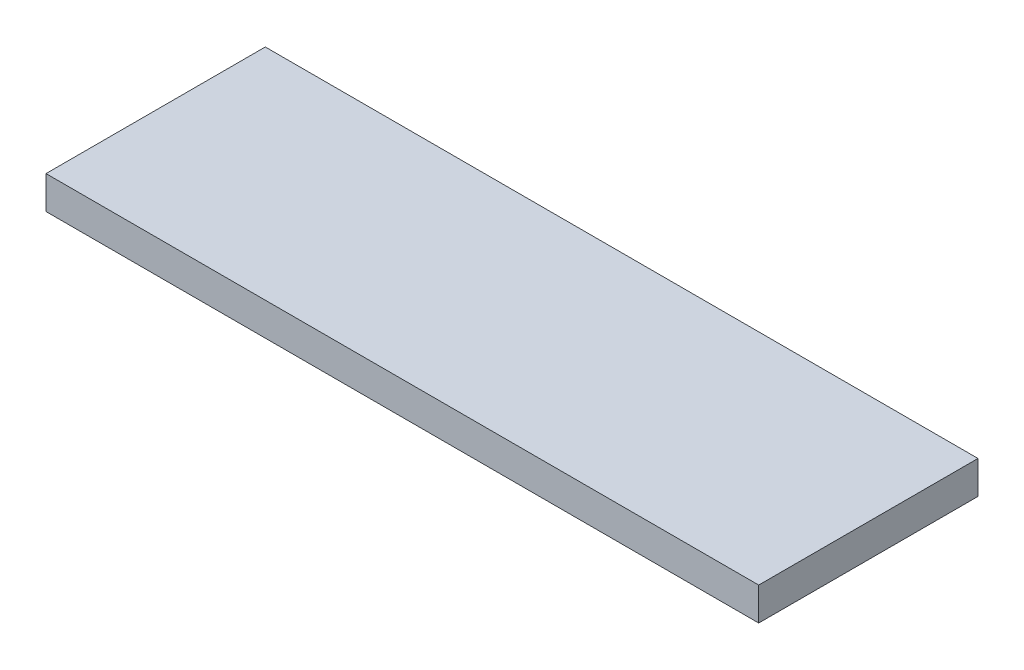
ISO-10303-21;
HEADER;
FILE_DESCRIPTION(('STEP AP214'),'2;1');
FILE_NAME('part.step','',(''),(''),'','','');
FILE_SCHEMA(('AUTOMOTIVE_DESIGN { 1 0 10303 214 1 1 1 1 }'));
ENDSEC;
DATA;
#1=APPLICATION_CONTEXT('core data for automotive mechanical design processes');
#2=APPLICATION_PROTOCOL_DEFINITION('international standard','automotive_design',2000,#1);
#3=PRODUCT_CONTEXT('',#1,'mechanical');
#4=PRODUCT('Part','Part','',(#3));
#5=PRODUCT_RELATED_PRODUCT_CATEGORY('part','',(#4));
#6=PRODUCT_DEFINITION_FORMATION('','',#4);
#7=PRODUCT_DEFINITION_CONTEXT('part definition',#1,'design');
#8=PRODUCT_DEFINITION('design','',#6,#7);
#9=PRODUCT_DEFINITION_SHAPE('','',#8);
#10=(LENGTH_UNIT() NAMED_UNIT(*) SI_UNIT(.MILLI.,.METRE.));
#11=(NAMED_UNIT(*) PLANE_ANGLE_UNIT() SI_UNIT($,.RADIAN.));
#12=(NAMED_UNIT(*) SI_UNIT($,.STERADIAN.) SOLID_ANGLE_UNIT());
#13=UNCERTAINTY_MEASURE_WITH_UNIT(LENGTH_MEASURE(1.E-05),#10,'distance_accuracy_value','');
#14=(GEOMETRIC_REPRESENTATION_CONTEXT(3) GLOBAL_UNCERTAINTY_ASSIGNED_CONTEXT((#13)) GLOBAL_UNIT_ASSIGNED_CONTEXT((#10,
#11,#12)) REPRESENTATION_CONTEXT('',''));
#15=CARTESIAN_POINT('',(0.,0.,0.));
#16=DIRECTION('',(0.,0.,1.));
#17=DIRECTION('',(1.,0.,0.));
#18=AXIS2_PLACEMENT_3D('',#15,#16,#17);
#19=CARTESIAN_POINT('',(90.,-10.,0.));
#20=DIRECTION('',(0.,1.,0.));
#21=DIRECTION('',(0.,0.,1.));
#22=AXIS2_PLACEMENT_3D('',#19,#20,#21);
#23=PLANE('',#22);
#24=DIRECTION('',(0.,0.,1.));
#25=VECTOR('',#24,1.);
#26=CARTESIAN_POINT('',(50.65,-10.,0.));
#27=LINE('',#26,#25);
#28=CARTESIAN_POINT('',(50.65,-10.,-5.65));
#29=VERTEX_POINT('',#28);
#30=CARTESIAN_POINT('',(50.65,-10.,5.65));
#31=VERTEX_POINT('',#30);
#32=EDGE_CURVE('E412',#29,#31,#27,.T.);
#33=ORIENTED_EDGE('',*,*,#32,.T.);
#34=DIRECTION('',(-1.,0.,0.));
#35=VECTOR('',#34,1.);
#36=CARTESIAN_POINT('',(90.,-10.,5.65));
#37=LINE('',#36,#35);
#38=CARTESIAN_POINT('',(39.35,-10.,5.65));
#39=VERTEX_POINT('',#38);
#40=EDGE_CURVE('E416',#31,#39,#37,.T.);
#41=ORIENTED_EDGE('',*,*,#40,.T.);
#42=DIRECTION('',(0.,0.,-1.));
#43=VECTOR('',#42,1.);
#44=CARTESIAN_POINT('',(39.35,-10.,0.));
#45=LINE('',#44,#43);
#46=CARTESIAN_POINT('',(39.35,-10.,-5.65));
#47=VERTEX_POINT('',#46);
#48=EDGE_CURVE('E406',#39,#47,#45,.T.);
#49=ORIENTED_EDGE('',*,*,#48,.T.);
#50=DIRECTION('',(1.,0.,0.));
#51=VECTOR('',#50,1.);
#52=CARTESIAN_POINT('',(90.,-10.,-5.65));
#53=LINE('',#52,#51);
#54=EDGE_CURVE('E411',#47,#29,#53,.T.);
#55=ORIENTED_EDGE('',*,*,#54,.T.);
#56=EDGE_LOOP('',(#33,#41,#49,#55));
#57=FACE_BOUND('',#56,.T.);
#58=ADVANCED_FACE('F50',(#57),#23,.F.);
#59=CARTESIAN_POINT('',(38.85,-10.,6.15));
#60=DIRECTION('',(0.,0.,-1.));
#61=DIRECTION('',(-1.,0.,0.));
#62=AXIS2_PLACEMENT_3D('',#59,#60,#61);
#63=PLANE('',#62);
#64=DIRECTION('',(0.,1.,0.));
#65=VECTOR('',#64,1.);
#66=CARTESIAN_POINT('',(38.85,-10.,6.15));
#67=LINE('',#66,#65);
#68=CARTESIAN_POINT('',(38.85,-9.5,6.15));
#69=VERTEX_POINT('',#68);
#70=CARTESIAN_POINT('',(38.85,0.,6.15));
#71=VERTEX_POINT('',#70);
#72=EDGE_CURVE('E396',#69,#71,#67,.T.);
#73=ORIENTED_EDGE('',*,*,#72,.F.);
#74=DIRECTION('',(1.,0.,0.));
#75=VECTOR('',#74,1.);
#76=CARTESIAN_POINT('',(38.85,-9.5,6.15));
#77=LINE('',#76,#75);
#78=CARTESIAN_POINT('',(51.15,-9.5,6.15));
#79=VERTEX_POINT('',#78);
#80=EDGE_CURVE('E425',#69,#79,#77,.T.);
#81=ORIENTED_EDGE('',*,*,#80,.T.);
#82=DIRECTION('',(0.,1.,0.));
#83=VECTOR('',#82,1.);
#84=CARTESIAN_POINT('',(51.15,-10.,6.15));
#85=LINE('',#84,#83);
#86=CARTESIAN_POINT('',(51.15,0.,6.15));
#87=VERTEX_POINT('',#86);
#88=EDGE_CURVE('E407',#79,#87,#85,.T.);
#89=ORIENTED_EDGE('',*,*,#88,.T.);
#90=DIRECTION('',(-1.,0.,0.));
#91=VECTOR('',#90,1.);
#92=CARTESIAN_POINT('',(38.85,0.,6.15));
#93=LINE('',#92,#91);
#94=EDGE_CURVE('E384',#87,#71,#93,.T.);
#95=ORIENTED_EDGE('',*,*,#94,.T.);
#96=EDGE_LOOP('',(#73,#81,#89,#95));
#97=FACE_BOUND('',#96,.T.);
#98=ADVANCED_FACE('F591',(#97),#63,.F.);
#99=CARTESIAN_POINT('',(51.15,-10.,-6.15));
#100=DIRECTION('',(-1.,0.,0.));
#101=DIRECTION('',(0.,0.,1.));
#102=AXIS2_PLACEMENT_3D('',#99,#100,#101);
#103=PLANE('',#102);
#104=ORIENTED_EDGE('',*,*,#88,.F.);
#105=DIRECTION('',(0.,0.,-1.));
#106=VECTOR('',#105,1.);
#107=CARTESIAN_POINT('',(51.15,-9.5,-6.15));
#108=LINE('',#107,#106);
#109=CARTESIAN_POINT('',(51.15,-9.5,-6.15));
#110=VERTEX_POINT('',#109);
#111=EDGE_CURVE('E426',#79,#110,#108,.T.);
#112=ORIENTED_EDGE('',*,*,#111,.T.);
#113=DIRECTION('',(0.,1.,0.));
#114=VECTOR('',#113,1.);
#115=CARTESIAN_POINT('',(51.15,-10.,-6.15));
#116=LINE('',#115,#114);
#117=CARTESIAN_POINT('',(51.15,0.,-6.15));
#118=VERTEX_POINT('',#117);
#119=EDGE_CURVE('E401',#110,#118,#116,.T.);
#120=ORIENTED_EDGE('',*,*,#119,.T.);
#121=DIRECTION('',(0.,0.,1.));
#122=VECTOR('',#121,1.);
#123=CARTESIAN_POINT('',(51.15,0.,-6.15));
#124=LINE('',#123,#122);
#125=EDGE_CURVE('E386',#118,#87,#124,.T.);
#126=ORIENTED_EDGE('',*,*,#125,.T.);
#127=EDGE_LOOP('',(#104,#112,#120,#126));
#128=FACE_BOUND('',#127,.T.);
#129=ADVANCED_FACE('F598',(#128),#103,.F.);
#130=CARTESIAN_POINT('',(38.85,-10.,-6.15));
#131=DIRECTION('',(0.,0.,1.));
#132=DIRECTION('',(1.,0.,0.));
#133=AXIS2_PLACEMENT_3D('',#130,#131,#132);
#134=PLANE('',#133);
#135=ORIENTED_EDGE('',*,*,#119,.F.);
#136=DIRECTION('',(-1.,0.,0.));
#137=VECTOR('',#136,1.);
#138=CARTESIAN_POINT('',(38.85,-9.5,-6.15));
#139=LINE('',#138,#137);
#140=CARTESIAN_POINT('',(38.85,-9.5,-6.15));
#141=VERTEX_POINT('',#140);
#142=EDGE_CURVE('E427',#110,#141,#139,.T.);
#143=ORIENTED_EDGE('',*,*,#142,.T.);
#144=DIRECTION('',(0.,1.,0.));
#145=VECTOR('',#144,1.);
#146=CARTESIAN_POINT('',(38.85,-10.,-6.15));
#147=LINE('',#146,#145);
#148=CARTESIAN_POINT('',(38.85,0.,-6.15));
#149=VERTEX_POINT('',#148);
#150=EDGE_CURVE('E399',#141,#149,#147,.T.);
#151=ORIENTED_EDGE('',*,*,#150,.T.);
#152=DIRECTION('',(1.,0.,0.));
#153=VECTOR('',#152,1.);
#154=CARTESIAN_POINT('',(38.85,0.,-6.15));
#155=LINE('',#154,#153);
#156=EDGE_CURVE('E394',#149,#118,#155,.T.);
#157=ORIENTED_EDGE('',*,*,#156,.T.);
#158=EDGE_LOOP('',(#135,#143,#151,#157));
#159=FACE_BOUND('',#158,.T.);
#160=ADVANCED_FACE('F866',(#159),#134,.F.);
#161=CARTESIAN_POINT('',(38.85,-10.,-6.15));
#162=DIRECTION('',(1.,0.,0.));
#163=DIRECTION('',(0.,0.,-1.));
#164=AXIS2_PLACEMENT_3D('',#161,#162,#163);
#165=PLANE('',#164);
#166=ORIENTED_EDGE('',*,*,#150,.F.);
#167=DIRECTION('',(0.,0.,1.));
#168=VECTOR('',#167,1.);
#169=CARTESIAN_POINT('',(38.85,-9.5,-6.15));
#170=LINE('',#169,#168);
#171=EDGE_CURVE('E435',#141,#69,#170,.T.);
#172=ORIENTED_EDGE('',*,*,#171,.T.);
#173=ORIENTED_EDGE('',*,*,#72,.T.);
#174=DIRECTION('',(0.,0.,-1.));
#175=VECTOR('',#174,1.);
#176=CARTESIAN_POINT('',(38.85,0.,-6.15));
#177=LINE('',#176,#175);
#178=EDGE_CURVE('E381',#71,#149,#177,.T.);
#179=ORIENTED_EDGE('',*,*,#178,.T.);
#180=EDGE_LOOP('',(#166,#172,#173,#179));
#181=FACE_BOUND('',#180,.T.);
#182=ADVANCED_FACE('F858',(#181),#165,.F.);
#183=CARTESIAN_POINT('',(60.,-10.,0.));
#184=DIRECTION('',(0.,1.,0.));
#185=DIRECTION('',(0.,0.,1.));
#186=AXIS2_PLACEMENT_3D('',#183,#184,#185);
#187=PLANE('',#186);
#188=DIRECTION('',(0.,0.,1.));
#189=VECTOR('',#188,1.);
#190=CARTESIAN_POINT('',(20.65,-10.,0.));
#191=LINE('',#190,#189);
#192=CARTESIAN_POINT('',(20.65,-10.,-5.65));
#193=VERTEX_POINT('',#192);
#194=CARTESIAN_POINT('',(20.65,-10.,5.65));
#195=VERTEX_POINT('',#194);
#196=EDGE_CURVE('E442',#193,#195,#191,.T.);
#197=ORIENTED_EDGE('',*,*,#196,.T.);
#198=DIRECTION('',(-1.,0.,0.));
#199=VECTOR('',#198,1.);
#200=CARTESIAN_POINT('',(60.,-10.,5.65));
#201=LINE('',#200,#199);
#202=CARTESIAN_POINT('',(9.35000000000001,-10.,5.65));
#203=VERTEX_POINT('',#202);
#204=EDGE_CURVE('E441',#195,#203,#201,.T.);
#205=ORIENTED_EDGE('',*,*,#204,.T.);
#206=DIRECTION('',(0.,0.,-1.));
#207=VECTOR('',#206,1.);
#208=CARTESIAN_POINT('',(9.35000000000001,-10.,0.));
#209=LINE('',#208,#207);
#210=CARTESIAN_POINT('',(9.35000000000001,-10.,-5.65));
#211=VERTEX_POINT('',#210);
#212=EDGE_CURVE('E434',#203,#211,#209,.T.);
#213=ORIENTED_EDGE('',*,*,#212,.T.);
#214=DIRECTION('',(1.,0.,0.));
#215=VECTOR('',#214,1.);
#216=CARTESIAN_POINT('',(60.,-10.,-5.65));
#217=LINE('',#216,#215);
#218=EDGE_CURVE('E437',#211,#193,#217,.T.);
#219=ORIENTED_EDGE('',*,*,#218,.T.);
#220=EDGE_LOOP('',(#197,#205,#213,#219));
#221=FACE_BOUND('',#220,.T.);
#222=ADVANCED_FACE('F847',(#221),#187,.F.);
#223=CARTESIAN_POINT('',(8.85000000000001,-10.,6.15));
#224=DIRECTION('',(0.,0.,-1.));
#225=DIRECTION('',(-1.,0.,0.));
#226=AXIS2_PLACEMENT_3D('',#223,#224,#225);
#227=PLANE('',#226);
#228=DIRECTION('',(0.,1.,0.));
#229=VECTOR('',#228,1.);
#230=CARTESIAN_POINT('',(8.85000000000001,-10.,6.15));
#231=LINE('',#230,#229);
#232=CARTESIAN_POINT('',(8.85000000000001,-9.5,6.15));
#233=VERTEX_POINT('',#232);
#234=CARTESIAN_POINT('',(8.85000000000001,0.,6.15));
#235=VERTEX_POINT('',#234);
#236=EDGE_CURVE('E375',#233,#235,#231,.T.);
#237=ORIENTED_EDGE('',*,*,#236,.F.);
#238=DIRECTION('',(1.,0.,0.));
#239=VECTOR('',#238,1.);
#240=CARTESIAN_POINT('',(8.85000000000001,-9.5,6.15));
#241=LINE('',#240,#239);
#242=CARTESIAN_POINT('',(21.15,-9.5,6.15));
#243=VERTEX_POINT('',#242);
#244=EDGE_CURVE('E449',#233,#243,#241,.T.);
#245=ORIENTED_EDGE('',*,*,#244,.T.);
#246=DIRECTION('',(0.,1.,0.));
#247=VECTOR('',#246,1.);
#248=CARTESIAN_POINT('',(21.15,-10.,6.15));
#249=LINE('',#248,#247);
#250=CARTESIAN_POINT('',(21.15,0.,6.15));
#251=VERTEX_POINT('',#250);
#252=EDGE_CURVE('E378',#243,#251,#249,.T.);
#253=ORIENTED_EDGE('',*,*,#252,.T.);
#254=DIRECTION('',(-1.,0.,0.));
#255=VECTOR('',#254,1.);
#256=CARTESIAN_POINT('',(8.85000000000001,0.,6.15));
#257=LINE('',#256,#255);
#258=EDGE_CURVE('E356',#251,#235,#257,.T.);
#259=ORIENTED_EDGE('',*,*,#258,.T.);
#260=EDGE_LOOP('',(#237,#245,#253,#259));
#261=FACE_BOUND('',#260,.T.);
#262=ADVANCED_FACE('F838',(#261),#227,.F.);
#263=CARTESIAN_POINT('',(21.15,-10.,-6.15));
#264=DIRECTION('',(-1.,0.,0.));
#265=DIRECTION('',(0.,0.,1.));
#266=AXIS2_PLACEMENT_3D('',#263,#264,#265);
#267=PLANE('',#266);
#268=ORIENTED_EDGE('',*,*,#252,.F.);
#269=DIRECTION('',(0.,0.,-1.));
#270=VECTOR('',#269,1.);
#271=CARTESIAN_POINT('',(21.15,-9.5,-6.15));
#272=LINE('',#271,#270);
#273=CARTESIAN_POINT('',(21.15,-9.5,-6.15));
#274=VERTEX_POINT('',#273);
#275=EDGE_CURVE('E454',#243,#274,#272,.T.);
#276=ORIENTED_EDGE('',*,*,#275,.T.);
#277=DIRECTION('',(0.,1.,0.));
#278=VECTOR('',#277,1.);
#279=CARTESIAN_POINT('',(21.15,-10.,-6.15));
#280=LINE('',#279,#278);
#281=CARTESIAN_POINT('',(21.15,0.,-6.15));
#282=VERTEX_POINT('',#281);
#283=EDGE_CURVE('E374',#274,#282,#280,.T.);
#284=ORIENTED_EDGE('',*,*,#283,.T.);
#285=DIRECTION('',(0.,0.,1.));
#286=VECTOR('',#285,1.);
#287=CARTESIAN_POINT('',(21.15,0.,-6.15));
#288=LINE('',#287,#286);
#289=EDGE_CURVE('E363',#282,#251,#288,.T.);
#290=ORIENTED_EDGE('',*,*,#289,.T.);
#291=EDGE_LOOP('',(#268,#276,#284,#290));
#292=FACE_BOUND('',#291,.T.);
#293=ADVANCED_FACE('F827',(#292),#267,.F.);
#294=CARTESIAN_POINT('',(8.85000000000001,-10.,-6.15));
#295=DIRECTION('',(0.,0.,1.));
#296=DIRECTION('',(1.,0.,0.));
#297=AXIS2_PLACEMENT_3D('',#294,#295,#296);
#298=PLANE('',#297);
#299=ORIENTED_EDGE('',*,*,#283,.F.);
#300=DIRECTION('',(-1.,0.,0.));
#301=VECTOR('',#300,1.);
#302=CARTESIAN_POINT('',(8.85000000000001,-9.5,-6.15));
#303=LINE('',#302,#301);
#304=CARTESIAN_POINT('',(8.85000000000001,-9.5,-6.15));
#305=VERTEX_POINT('',#304);
#306=EDGE_CURVE('E451',#274,#305,#303,.T.);
#307=ORIENTED_EDGE('',*,*,#306,.T.);
#308=DIRECTION('',(0.,1.,0.));
#309=VECTOR('',#308,1.);
#310=CARTESIAN_POINT('',(8.85000000000001,-10.,-6.15));
#311=LINE('',#310,#309);
#312=CARTESIAN_POINT('',(8.85000000000001,0.,-6.15));
#313=VERTEX_POINT('',#312);
#314=EDGE_CURVE('E369',#305,#313,#311,.T.);
#315=ORIENTED_EDGE('',*,*,#314,.T.);
#316=DIRECTION('',(1.,0.,0.));
#317=VECTOR('',#316,1.);
#318=CARTESIAN_POINT('',(8.85000000000001,0.,-6.15));
#319=LINE('',#318,#317);
#320=EDGE_CURVE('E364',#313,#282,#319,.T.);
#321=ORIENTED_EDGE('',*,*,#320,.T.);
#322=EDGE_LOOP('',(#299,#307,#315,#321));
#323=FACE_BOUND('',#322,.T.);
#324=ADVANCED_FACE('F814',(#323),#298,.F.);
#325=CARTESIAN_POINT('',(8.85000000000001,-10.,-6.15));
#326=DIRECTION('',(1.,0.,0.));
#327=DIRECTION('',(0.,0.,-1.));
#328=AXIS2_PLACEMENT_3D('',#325,#326,#327);
#329=PLANE('',#328);
#330=ORIENTED_EDGE('',*,*,#314,.F.);
#331=DIRECTION('',(0.,0.,1.));
#332=VECTOR('',#331,1.);
#333=CARTESIAN_POINT('',(8.85000000000001,-9.5,-6.15));
#334=LINE('',#333,#332);
#335=EDGE_CURVE('E456',#305,#233,#334,.T.);
#336=ORIENTED_EDGE('',*,*,#335,.T.);
#337=ORIENTED_EDGE('',*,*,#236,.T.);
#338=DIRECTION('',(0.,0.,-1.));
#339=VECTOR('',#338,1.);
#340=CARTESIAN_POINT('',(8.85000000000001,0.,-6.15));
#341=LINE('',#340,#339);
#342=EDGE_CURVE('E354',#235,#313,#341,.T.);
#343=ORIENTED_EDGE('',*,*,#342,.T.);
#344=EDGE_LOOP('',(#330,#336,#337,#343));
#345=FACE_BOUND('',#344,.T.);
#346=ADVANCED_FACE('F809',(#345),#329,.F.);
#347=CARTESIAN_POINT('',(0.,0.,0.));
#348=DIRECTION('',(0.,1.,0.));
#349=DIRECTION('',(0.,0.,1.));
#350=AXIS2_PLACEMENT_3D('',#347,#348,#349);
#351=PLANE('',#350);
#352=DIRECTION('',(0.,0.,-1.));
#353=VECTOR('',#352,1.);
#354=CARTESIAN_POINT('',(-51.15,0.,-6.15));
#355=LINE('',#354,#353);
#356=CARTESIAN_POINT('',(-51.15,0.,6.15));
#357=VERTEX_POINT('',#356);
#358=CARTESIAN_POINT('',(-51.15,0.,-6.15));
#359=VERTEX_POINT('',#358);
#360=EDGE_CURVE('E259',#357,#359,#355,.T.);
#361=ORIENTED_EDGE('',*,*,#360,.F.);
#362=DIRECTION('',(-1.,0.,0.));
#363=VECTOR('',#362,1.);
#364=CARTESIAN_POINT('',(-51.15,0.,6.15));
#365=LINE('',#364,#363);
#366=CARTESIAN_POINT('',(-38.85,0.,6.15));
#367=VERTEX_POINT('',#366);
#368=EDGE_CURVE('E293',#367,#357,#365,.T.);
#369=ORIENTED_EDGE('',*,*,#368,.F.);
#370=DIRECTION('',(0.,0.,1.));
#371=VECTOR('',#370,1.);
#372=CARTESIAN_POINT('',(-38.85,0.,-6.15));
#373=LINE('',#372,#371);
#374=CARTESIAN_POINT('',(-38.85,0.,-6.15));
#375=VERTEX_POINT('',#374);
#376=EDGE_CURVE('E292',#375,#367,#373,.T.);
#377=ORIENTED_EDGE('',*,*,#376,.F.);
#378=DIRECTION('',(1.,0.,0.));
#379=VECTOR('',#378,1.);
#380=CARTESIAN_POINT('',(-51.15,0.,-6.15));
#381=LINE('',#380,#379);
#382=EDGE_CURVE('E289',#359,#375,#381,.T.);
#383=ORIENTED_EDGE('',*,*,#382,.F.);
#384=EDGE_LOOP('',(#361,#369,#377,#383));
#385=FACE_BOUND('',#384,.T.);
#386=DIRECTION('',(0.,0.,-1.));
#387=VECTOR('',#386,1.);
#388=CARTESIAN_POINT('',(65.,0.,-20.));
#389=LINE('',#388,#387);
#390=CARTESIAN_POINT('',(65.,0.,20.));
#391=VERTEX_POINT('',#390);
#392=CARTESIAN_POINT('',(65.,0.,-20.));
#393=VERTEX_POINT('',#392);
#394=EDGE_CURVE('E313',#391,#393,#389,.T.);
#395=ORIENTED_EDGE('',*,*,#394,.F.);
#396=DIRECTION('',(1.,0.,0.));
#397=VECTOR('',#396,1.);
#398=CARTESIAN_POINT('',(-65.,0.,20.));
#399=LINE('',#398,#397);
#400=CARTESIAN_POINT('',(-65.,0.,20.));
#401=VERTEX_POINT('',#400);
#402=EDGE_CURVE('E320',#401,#391,#399,.T.);
#403=ORIENTED_EDGE('',*,*,#402,.F.);
#404=DIRECTION('',(0.,0.,1.));
#405=VECTOR('',#404,1.);
#406=CARTESIAN_POINT('',(-65.,0.,-20.));
#407=LINE('',#406,#405);
#408=CARTESIAN_POINT('',(-65.,0.,-20.));
#409=VERTEX_POINT('',#408);
#410=EDGE_CURVE('E334',#409,#401,#407,.T.);
#411=ORIENTED_EDGE('',*,*,#410,.F.);
#412=DIRECTION('',(-1.,0.,0.));
#413=VECTOR('',#412,1.);
#414=CARTESIAN_POINT('',(-65.,0.,-20.));
#415=LINE('',#414,#413);
#416=EDGE_CURVE('E329',#393,#409,#415,.T.);
#417=ORIENTED_EDGE('',*,*,#416,.F.);
#418=EDGE_LOOP('',(#395,#403,#411,#417));
#419=FACE_BOUND('',#418,.T.);
#420=DIRECTION('',(0.,0.,-1.));
#421=VECTOR('',#420,1.);
#422=CARTESIAN_POINT('',(-21.15,0.,-6.15));
#423=LINE('',#422,#421);
#424=CARTESIAN_POINT('',(-21.15,0.,6.15));
#425=VERTEX_POINT('',#424);
#426=CARTESIAN_POINT('',(-21.15,0.,-6.15));
#427=VERTEX_POINT('',#426);
#428=EDGE_CURVE('E239',#425,#427,#423,.T.);
#429=ORIENTED_EDGE('',*,*,#428,.F.);
#430=DIRECTION('',(-1.,0.,0.));
#431=VECTOR('',#430,1.);
#432=CARTESIAN_POINT('',(-21.15,0.,6.15));
#433=LINE('',#432,#431);
#434=CARTESIAN_POINT('',(-8.84999999999999,0.,6.15));
#435=VERTEX_POINT('',#434);
#436=EDGE_CURVE('E246',#435,#425,#433,.T.);
#437=ORIENTED_EDGE('',*,*,#436,.F.);
#438=DIRECTION('',(0.,0.,1.));
#439=VECTOR('',#438,1.);
#440=CARTESIAN_POINT('',(-8.84999999999999,0.,-6.15));
#441=LINE('',#440,#439);
#442=CARTESIAN_POINT('',(-8.84999999999999,0.,-6.15));
#443=VERTEX_POINT('',#442);
#444=EDGE_CURVE('E273',#443,#435,#441,.T.);
#445=ORIENTED_EDGE('',*,*,#444,.F.);
#446=DIRECTION('',(1.,0.,0.));
#447=VECTOR('',#446,1.);
#448=CARTESIAN_POINT('',(-21.15,0.,-6.15));
#449=LINE('',#448,#447);
#450=EDGE_CURVE('E260',#427,#443,#449,.T.);
#451=ORIENTED_EDGE('',*,*,#450,.F.);
#452=EDGE_LOOP('',(#429,#437,#445,#451));
#453=FACE_BOUND('',#452,.T.);
#454=ORIENTED_EDGE('',*,*,#342,.F.);
#455=ORIENTED_EDGE('',*,*,#258,.F.);
#456=ORIENTED_EDGE('',*,*,#289,.F.);
#457=ORIENTED_EDGE('',*,*,#320,.F.);
#458=EDGE_LOOP('',(#454,#455,#456,#457));
#459=FACE_BOUND('',#458,.T.);
#460=ORIENTED_EDGE('',*,*,#178,.F.);
#461=ORIENTED_EDGE('',*,*,#94,.F.);
#462=ORIENTED_EDGE('',*,*,#125,.F.);
#463=ORIENTED_EDGE('',*,*,#156,.F.);
#464=EDGE_LOOP('',(#460,#461,#462,#463));
#465=FACE_BOUND('',#464,.T.);
#466=ADVANCED_FACE('F252',(#385,#419,#453,#459,#465),#351,.F.);
#467=CARTESIAN_POINT('',(65.,6.,-20.));
#468=DIRECTION('',(-1.,0.,0.));
#469=DIRECTION('',(0.,0.,1.));
#470=AXIS2_PLACEMENT_3D('',#467,#468,#469);
#471=PLANE('',#470);
#472=ORIENTED_EDGE('',*,*,#394,.T.);
#473=DIRECTION('',(0.,-1.,0.));
#474=VECTOR('',#473,1.);
#475=CARTESIAN_POINT('',(65.,6.,-20.));
#476=LINE('',#475,#474);
#477=CARTESIAN_POINT('',(65.,6.,-20.));
#478=VERTEX_POINT('',#477);
#479=EDGE_CURVE('E349',#478,#393,#476,.T.);
#480=ORIENTED_EDGE('',*,*,#479,.F.);
#481=DIRECTION('',(0.,0.,-1.));
#482=VECTOR('',#481,1.);
#483=CARTESIAN_POINT('',(65.,6.,-20.));
#484=LINE('',#483,#482);
#485=CARTESIAN_POINT('',(65.,6.,20.));
#486=VERTEX_POINT('',#485);
#487=EDGE_CURVE('E315',#486,#478,#484,.T.);
#488=ORIENTED_EDGE('',*,*,#487,.F.);
#489=DIRECTION('',(0.,-1.,0.));
#490=VECTOR('',#489,1.);
#491=CARTESIAN_POINT('',(65.,6.,20.));
#492=LINE('',#491,#490);
#493=EDGE_CURVE('E326',#486,#391,#492,.T.);
#494=ORIENTED_EDGE('',*,*,#493,.T.);
#495=EDGE_LOOP('',(#472,#480,#488,#494));
#496=FACE_BOUND('',#495,.T.);
#497=ADVANCED_FACE('F898',(#496),#471,.F.);
#498=CARTESIAN_POINT('',(-65.,6.,-20.));
#499=DIRECTION('',(0.,0.,1.));
#500=DIRECTION('',(1.,0.,0.));
#501=AXIS2_PLACEMENT_3D('',#498,#499,#500);
#502=PLANE('',#501);
#503=ORIENTED_EDGE('',*,*,#416,.T.);
#504=DIRECTION('',(0.,-1.,0.));
#505=VECTOR('',#504,1.);
#506=CARTESIAN_POINT('',(-65.,6.,-20.));
#507=LINE('',#506,#505);
#508=CARTESIAN_POINT('',(-65.,6.,-20.));
#509=VERTEX_POINT('',#508);
#510=EDGE_CURVE('E341',#509,#409,#507,.T.);
#511=ORIENTED_EDGE('',*,*,#510,.F.);
#512=DIRECTION('',(-1.,0.,0.));
#513=VECTOR('',#512,1.);
#514=CARTESIAN_POINT('',(-65.,6.,-20.));
#515=LINE('',#514,#513);
#516=EDGE_CURVE('E316',#478,#509,#515,.T.);
#517=ORIENTED_EDGE('',*,*,#516,.F.);
#518=ORIENTED_EDGE('',*,*,#479,.T.);
#519=EDGE_LOOP('',(#503,#511,#517,#518));
#520=FACE_BOUND('',#519,.T.);
#521=ADVANCED_FACE('F968',(#520),#502,.F.);
#522=CARTESIAN_POINT('',(-65.,6.,-20.));
#523=DIRECTION('',(1.,0.,0.));
#524=DIRECTION('',(0.,0.,-1.));
#525=AXIS2_PLACEMENT_3D('',#522,#523,#524);
#526=PLANE('',#525);
#527=ORIENTED_EDGE('',*,*,#410,.T.);
#528=DIRECTION('',(0.,-1.,0.));
#529=VECTOR('',#528,1.);
#530=CARTESIAN_POINT('',(-65.,6.,20.));
#531=LINE('',#530,#529);
#532=CARTESIAN_POINT('',(-65.,6.,20.));
#533=VERTEX_POINT('',#532);
#534=EDGE_CURVE('E343',#533,#401,#531,.T.);
#535=ORIENTED_EDGE('',*,*,#534,.F.);
#536=DIRECTION('',(0.,0.,1.));
#537=VECTOR('',#536,1.);
#538=CARTESIAN_POINT('',(-65.,6.,-20.));
#539=LINE('',#538,#537);
#540=EDGE_CURVE('E319',#509,#533,#539,.T.);
#541=ORIENTED_EDGE('',*,*,#540,.F.);
#542=ORIENTED_EDGE('',*,*,#510,.T.);
#543=EDGE_LOOP('',(#527,#535,#541,#542));
#544=FACE_BOUND('',#543,.T.);
#545=ADVANCED_FACE('F957',(#544),#526,.F.);
#546=CARTESIAN_POINT('',(-65.,6.,20.));
#547=DIRECTION('',(0.,0.,-1.));
#548=DIRECTION('',(-1.,0.,0.));
#549=AXIS2_PLACEMENT_3D('',#546,#547,#548);
#550=PLANE('',#549);
#551=ORIENTED_EDGE('',*,*,#402,.T.);
#552=ORIENTED_EDGE('',*,*,#493,.F.);
#553=DIRECTION('',(1.,0.,0.));
#554=VECTOR('',#553,1.);
#555=CARTESIAN_POINT('',(-65.,6.,20.));
#556=LINE('',#555,#554);
#557=EDGE_CURVE('E323',#533,#486,#556,.T.);
#558=ORIENTED_EDGE('',*,*,#557,.F.);
#559=ORIENTED_EDGE('',*,*,#534,.T.);
#560=EDGE_LOOP('',(#551,#552,#558,#559));
#561=FACE_BOUND('',#560,.T.);
#562=ADVANCED_FACE('F948',(#561),#550,.F.);
#563=CARTESIAN_POINT('',(0.,6.,0.));
#564=DIRECTION('',(0.,1.,0.));
#565=DIRECTION('',(0.,0.,1.));
#566=AXIS2_PLACEMENT_3D('',#563,#564,#565);
#567=PLANE('',#566);
#568=ORIENTED_EDGE('',*,*,#487,.T.);
#569=ORIENTED_EDGE('',*,*,#516,.T.);
#570=ORIENTED_EDGE('',*,*,#540,.T.);
#571=ORIENTED_EDGE('',*,*,#557,.T.);
#572=EDGE_LOOP('',(#568,#569,#570,#571));
#573=FACE_BOUND('',#572,.T.);
#574=ADVANCED_FACE('F939',(#573),#567,.T.);
#575=CARTESIAN_POINT('',(-51.15,-10.,-6.15));
#576=DIRECTION('',(1.,0.,0.));
#577=DIRECTION('',(0.,0.,-1.));
#578=AXIS2_PLACEMENT_3D('',#575,#576,#577);
#579=PLANE('',#578);
#580=DIRECTION('',(0.,1.,0.));
#581=VECTOR('',#580,1.);
#582=CARTESIAN_POINT('',(-51.15,-10.,-6.15));
#583=LINE('',#582,#581);
#584=CARTESIAN_POINT('',(-51.15,-9.5,-6.15));
#585=VERTEX_POINT('',#584);
#586=EDGE_CURVE('E306',#585,#359,#583,.T.);
#587=ORIENTED_EDGE('',*,*,#586,.F.);
#588=DIRECTION('',(0.,0.,1.));
#589=VECTOR('',#588,1.);
#590=CARTESIAN_POINT('',(-51.15,-9.5,-6.15));
#591=LINE('',#590,#589);
#592=CARTESIAN_POINT('',(-51.15,-9.5,6.15));
#593=VERTEX_POINT('',#592);
#594=EDGE_CURVE('E11',#585,#593,#591,.T.);
#595=ORIENTED_EDGE('',*,*,#594,.T.);
#596=DIRECTION('',(0.,1.,0.));
#597=VECTOR('',#596,1.);
#598=CARTESIAN_POINT('',(-51.15,-10.,6.15));
#599=LINE('',#598,#597);
#600=EDGE_CURVE('E296',#593,#357,#599,.T.);
#601=ORIENTED_EDGE('',*,*,#600,.T.);
#602=ORIENTED_EDGE('',*,*,#360,.T.);
#603=EDGE_LOOP('',(#587,#595,#601,#602));
#604=FACE_BOUND('',#603,.T.);
#605=ADVANCED_FACE('F569',(#604),#579,.F.);
#606=CARTESIAN_POINT('',(-51.15,-10.,-6.15));
#607=DIRECTION('',(0.,0.,1.));
#608=DIRECTION('',(1.,0.,0.));
#609=AXIS2_PLACEMENT_3D('',#606,#607,#608);
#610=PLANE('',#609);
#611=DIRECTION('',(0.,1.,0.));
#612=VECTOR('',#611,1.);
#613=CARTESIAN_POINT('',(-38.85,-10.,-6.15));
#614=LINE('',#613,#612);
#615=CARTESIAN_POINT('',(-38.85,-9.5,-6.15));
#616=VERTEX_POINT('',#615);
#617=EDGE_CURVE('E302',#616,#375,#614,.T.);
#618=ORIENTED_EDGE('',*,*,#617,.F.);
#619=DIRECTION('',(-1.,0.,0.));
#620=VECTOR('',#619,1.);
#621=CARTESIAN_POINT('',(-51.15,-9.5,-6.15));
#622=LINE('',#621,#620);
#623=EDGE_CURVE('E59',#616,#585,#622,.T.);
#624=ORIENTED_EDGE('',*,*,#623,.T.);
#625=ORIENTED_EDGE('',*,*,#586,.T.);
#626=ORIENTED_EDGE('',*,*,#382,.T.);
#627=EDGE_LOOP('',(#618,#624,#625,#626));
#628=FACE_BOUND('',#627,.T.);
#629=ADVANCED_FACE('F925',(#628),#610,.F.);
#630=CARTESIAN_POINT('',(-38.85,-10.,-6.15));
#631=DIRECTION('',(-1.,0.,0.));
#632=DIRECTION('',(0.,0.,1.));
#633=AXIS2_PLACEMENT_3D('',#630,#631,#632);
#634=PLANE('',#633);
#635=DIRECTION('',(0.,1.,0.));
#636=VECTOR('',#635,1.);
#637=CARTESIAN_POINT('',(-38.85,-10.,6.15));
#638=LINE('',#637,#636);
#639=CARTESIAN_POINT('',(-38.85,-9.5,6.15));
#640=VERTEX_POINT('',#639);
#641=EDGE_CURVE('E301',#640,#367,#638,.T.);
#642=ORIENTED_EDGE('',*,*,#641,.F.);
#643=DIRECTION('',(0.,0.,-1.));
#644=VECTOR('',#643,1.);
#645=CARTESIAN_POINT('',(-38.85,-9.5,-6.15));
#646=LINE('',#645,#644);
#647=EDGE_CURVE('E71',#640,#616,#646,.T.);
#648=ORIENTED_EDGE('',*,*,#647,.T.);
#649=ORIENTED_EDGE('',*,*,#617,.T.);
#650=ORIENTED_EDGE('',*,*,#376,.T.);
#651=EDGE_LOOP('',(#642,#648,#649,#650));
#652=FACE_BOUND('',#651,.T.);
#653=ADVANCED_FACE('F586',(#652),#634,.F.);
#654=CARTESIAN_POINT('',(-51.15,-10.,6.15));
#655=DIRECTION('',(0.,0.,-1.));
#656=DIRECTION('',(-1.,0.,0.));
#657=AXIS2_PLACEMENT_3D('',#654,#655,#656);
#658=PLANE('',#657);
#659=ORIENTED_EDGE('',*,*,#600,.F.);
#660=DIRECTION('',(1.,0.,0.));
#661=VECTOR('',#660,1.);
#662=CARTESIAN_POINT('',(-51.15,-9.5,6.15));
#663=LINE('',#662,#661);
#664=EDGE_CURVE('E496',#593,#640,#663,.T.);
#665=ORIENTED_EDGE('',*,*,#664,.T.);
#666=ORIENTED_EDGE('',*,*,#641,.T.);
#667=ORIENTED_EDGE('',*,*,#368,.T.);
#668=EDGE_LOOP('',(#659,#665,#666,#667));
#669=FACE_BOUND('',#668,.T.);
#670=ADVANCED_FACE('F574',(#669),#658,.F.);
#671=CARTESIAN_POINT('',(0.,-10.,0.));
#672=DIRECTION('',(0.,1.,0.));
#673=DIRECTION('',(0.,0.,1.));
#674=AXIS2_PLACEMENT_3D('',#671,#672,#673);
#675=PLANE('',#674);
#676=DIRECTION('',(0.,0.,1.));
#677=VECTOR('',#676,1.);
#678=CARTESIAN_POINT('',(-39.35,-10.,0.));
#679=LINE('',#678,#677);
#680=CARTESIAN_POINT('',(-39.35,-10.,-5.65));
#681=VERTEX_POINT('',#680);
#682=CARTESIAN_POINT('',(-39.35,-10.,5.65));
#683=VERTEX_POINT('',#682);
#684=EDGE_CURVE('E495',#681,#683,#679,.T.);
#685=ORIENTED_EDGE('',*,*,#684,.T.);
#686=DIRECTION('',(-1.,0.,0.));
#687=VECTOR('',#686,1.);
#688=CARTESIAN_POINT('',(0.,-10.,5.65));
#689=LINE('',#688,#687);
#690=CARTESIAN_POINT('',(-50.65,-10.,5.65));
#691=VERTEX_POINT('',#690);
#692=EDGE_CURVE('E494',#683,#691,#689,.T.);
#693=ORIENTED_EDGE('',*,*,#692,.T.);
#694=DIRECTION('',(0.,0.,-1.));
#695=VECTOR('',#694,1.);
#696=CARTESIAN_POINT('',(-50.65,-10.,0.));
#697=LINE('',#696,#695);
#698=CARTESIAN_POINT('',(-50.65,-10.,-5.65));
#699=VERTEX_POINT('',#698);
#700=EDGE_CURVE('E486',#691,#699,#697,.T.);
#701=ORIENTED_EDGE('',*,*,#700,.T.);
#702=DIRECTION('',(1.,0.,0.));
#703=VECTOR('',#702,1.);
#704=CARTESIAN_POINT('',(0.,-10.,-5.65));
#705=LINE('',#704,#703);
#706=EDGE_CURVE('E487',#699,#681,#705,.T.);
#707=ORIENTED_EDGE('',*,*,#706,.T.);
#708=EDGE_LOOP('',(#685,#693,#701,#707));
#709=FACE_BOUND('',#708,.T.);
#710=ADVANCED_FACE('F578',(#709),#675,.F.);
#711=CARTESIAN_POINT('',(-21.15,-10.,-6.15));
#712=DIRECTION('',(1.,0.,0.));
#713=DIRECTION('',(0.,0.,-1.));
#714=AXIS2_PLACEMENT_3D('',#711,#712,#713);
#715=PLANE('',#714);
#716=DIRECTION('',(0.,1.,0.));
#717=VECTOR('',#716,1.);
#718=CARTESIAN_POINT('',(-21.15,-10.,-6.15));
#719=LINE('',#718,#717);
#720=CARTESIAN_POINT('',(-21.15,-9.5,-6.15));
#721=VERTEX_POINT('',#720);
#722=EDGE_CURVE('E257',#721,#427,#719,.T.);
#723=ORIENTED_EDGE('',*,*,#722,.F.);
#724=DIRECTION('',(0.,0.,1.));
#725=VECTOR('',#724,1.);
#726=CARTESIAN_POINT('',(-21.15,-9.5,-6.15));
#727=LINE('',#726,#725);
#728=CARTESIAN_POINT('',(-21.15,-9.5,6.15));
#729=VERTEX_POINT('',#728);
#730=EDGE_CURVE('E242',#721,#729,#727,.T.);
#731=ORIENTED_EDGE('',*,*,#730,.T.);
#732=DIRECTION('',(0.,1.,0.));
#733=VECTOR('',#732,1.);
#734=CARTESIAN_POINT('',(-21.15,-10.,6.15));
#735=LINE('',#734,#733);
#736=EDGE_CURVE('E231',#729,#425,#735,.T.);
#737=ORIENTED_EDGE('',*,*,#736,.T.);
#738=ORIENTED_EDGE('',*,*,#428,.T.);
#739=EDGE_LOOP('',(#723,#731,#737,#738));
#740=FACE_BOUND('',#739,.T.);
#741=ADVANCED_FACE('F236',(#740),#715,.F.);
#742=CARTESIAN_POINT('',(-21.15,-10.,-6.15));
#743=DIRECTION('',(0.,0.,1.));
#744=DIRECTION('',(1.,0.,0.));
#745=AXIS2_PLACEMENT_3D('',#742,#743,#744);
#746=PLANE('',#745);
#747=DIRECTION('',(0.,1.,0.));
#748=VECTOR('',#747,1.);
#749=CARTESIAN_POINT('',(-8.84999999999999,-10.,-6.15));
#750=LINE('',#749,#748);
#751=CARTESIAN_POINT('',(-8.84999999999999,-9.5,-6.15));
#752=VERTEX_POINT('',#751);
#753=EDGE_CURVE('E280',#752,#443,#750,.T.);
#754=ORIENTED_EDGE('',*,*,#753,.F.);
#755=DIRECTION('',(-1.,0.,0.));
#756=VECTOR('',#755,1.);
#757=CARTESIAN_POINT('',(-21.15,-9.5,-6.15));
#758=LINE('',#757,#756);
#759=EDGE_CURVE('E476',#752,#721,#758,.T.);
#760=ORIENTED_EDGE('',*,*,#759,.T.);
#761=ORIENTED_EDGE('',*,*,#722,.T.);
#762=ORIENTED_EDGE('',*,*,#450,.T.);
#763=EDGE_LOOP('',(#754,#760,#761,#762));
#764=FACE_BOUND('',#763,.T.);
#765=ADVANCED_FACE('F588',(#764),#746,.F.);
#766=CARTESIAN_POINT('',(-8.84999999999999,-10.,-6.15));
#767=DIRECTION('',(-1.,0.,0.));
#768=DIRECTION('',(0.,0.,1.));
#769=AXIS2_PLACEMENT_3D('',#766,#767,#768);
#770=PLANE('',#769);
#771=DIRECTION('',(0.,1.,0.));
#772=VECTOR('',#771,1.);
#773=CARTESIAN_POINT('',(-8.84999999999999,-10.,6.15));
#774=LINE('',#773,#772);
#775=CARTESIAN_POINT('',(-8.84999999999999,-9.5,6.15));
#776=VERTEX_POINT('',#775);
#777=EDGE_CURVE('E249',#776,#435,#774,.T.);
#778=ORIENTED_EDGE('',*,*,#777,.F.);
#779=DIRECTION('',(0.,0.,-1.));
#780=VECTOR('',#779,1.);
#781=CARTESIAN_POINT('',(-8.84999999999999,-9.5,-6.15));
#782=LINE('',#781,#780);
#783=EDGE_CURVE('E475',#776,#752,#782,.T.);
#784=ORIENTED_EDGE('',*,*,#783,.T.);
#785=ORIENTED_EDGE('',*,*,#753,.T.);
#786=ORIENTED_EDGE('',*,*,#444,.T.);
#787=EDGE_LOOP('',(#778,#784,#785,#786));
#788=FACE_BOUND('',#787,.T.);
#789=ADVANCED_FACE('F783',(#788),#770,.F.);
#790=CARTESIAN_POINT('',(-21.15,-10.,6.15));
#791=DIRECTION('',(0.,0.,-1.));
#792=DIRECTION('',(-1.,0.,0.));
#793=AXIS2_PLACEMENT_3D('',#790,#791,#792);
#794=PLANE('',#793);
#795=ORIENTED_EDGE('',*,*,#736,.F.);
#796=DIRECTION('',(1.,0.,0.));
#797=VECTOR('',#796,1.);
#798=CARTESIAN_POINT('',(-21.15,-9.5,6.15));
#799=LINE('',#798,#797);
#800=EDGE_CURVE('E483',#729,#776,#799,.T.);
#801=ORIENTED_EDGE('',*,*,#800,.T.);
#802=ORIENTED_EDGE('',*,*,#777,.T.);
#803=ORIENTED_EDGE('',*,*,#436,.T.);
#804=EDGE_LOOP('',(#795,#801,#802,#803));
#805=FACE_BOUND('',#804,.T.);
#806=ADVANCED_FACE('F265',(#805),#794,.F.);
#807=CARTESIAN_POINT('',(30.,-10.,0.));
#808=DIRECTION('',(0.,1.,0.));
#809=DIRECTION('',(0.,0.,1.));
#810=AXIS2_PLACEMENT_3D('',#807,#808,#809);
#811=PLANE('',#810);
#812=DIRECTION('',(1.,0.,0.));
#813=VECTOR('',#812,1.);
#814=CARTESIAN_POINT('',(30.,-10.,-5.65));
#815=LINE('',#814,#813);
#816=CARTESIAN_POINT('',(-20.65,-10.,-5.65));
#817=VERTEX_POINT('',#816);
#818=CARTESIAN_POINT('',(-9.34999999999999,-10.,-5.65));
#819=VERTEX_POINT('',#818);
#820=EDGE_CURVE('E466',#817,#819,#815,.T.);
#821=ORIENTED_EDGE('',*,*,#820,.T.);
#822=DIRECTION('',(0.,0.,1.));
#823=VECTOR('',#822,1.);
#824=CARTESIAN_POINT('',(-9.34999999999999,-10.,0.));
#825=LINE('',#824,#823);
#826=CARTESIAN_POINT('',(-9.34999999999999,-10.,5.65));
#827=VERTEX_POINT('',#826);
#828=EDGE_CURVE('E467',#819,#827,#825,.T.);
#829=ORIENTED_EDGE('',*,*,#828,.T.);
#830=DIRECTION('',(-1.,0.,0.));
#831=VECTOR('',#830,1.);
#832=CARTESIAN_POINT('',(30.,-10.,5.65));
#833=LINE('',#832,#831);
#834=CARTESIAN_POINT('',(-20.65,-10.,5.65));
#835=VERTEX_POINT('',#834);
#836=EDGE_CURVE('E462',#827,#835,#833,.T.);
#837=ORIENTED_EDGE('',*,*,#836,.T.);
#838=DIRECTION('',(0.,0.,-1.));
#839=VECTOR('',#838,1.);
#840=CARTESIAN_POINT('',(-20.65,-10.,0.));
#841=LINE('',#840,#839);
#842=EDGE_CURVE('E461',#835,#817,#841,.T.);
#843=ORIENTED_EDGE('',*,*,#842,.T.);
#844=EDGE_LOOP('',(#821,#829,#837,#843));
#845=FACE_BOUND('',#844,.T.);
#846=ADVANCED_FACE('F631',(#845),#811,.F.);
#847=CARTESIAN_POINT('',(90.,-10.,-5.65));
#848=DIRECTION('',(0.,0.707106781186547,0.707106781186547));
#849=DIRECTION('',(1.,0.,0.));
#850=AXIS2_PLACEMENT_3D('',#847,#848,#849);
#851=PLANE('',#850);
#852=DIRECTION('',(0.577350269189626,-0.577350269189626,0.577350269189626));
#853=VECTOR('',#852,1.);
#854=CARTESIAN_POINT('',(41.2333333333333,-11.8833333333333,-3.76666666666667));
#855=LINE('',#854,#853);
#856=EDGE_CURVE('E267',#141,#47,#855,.T.);
#857=ORIENTED_EDGE('',*,*,#856,.F.);
#858=ORIENTED_EDGE('',*,*,#142,.F.);
#859=DIRECTION('',(-0.577350269189626,-0.577350269189626,0.577350269189626));
#860=VECTOR('',#859,1.);
#861=CARTESIAN_POINT('',(63.7666666666667,3.11666666666666,-18.7666666666667));
#862=LINE('',#861,#860);
#863=EDGE_CURVE('E264',#29,#110,#862,.F.);
#864=ORIENTED_EDGE('',*,*,#863,.F.);
#865=ORIENTED_EDGE('',*,*,#54,.F.);
#866=EDGE_LOOP('',(#857,#858,#864,#865));
#867=FACE_BOUND('',#866,.T.);
#868=ADVANCED_FACE('F627',(#867),#851,.F.);
#869=CARTESIAN_POINT('',(50.65,-10.,0.));
#870=DIRECTION('',(-0.707106781186547,0.707106781186547,0.));
#871=DIRECTION('',(0.,0.,1.));
#872=AXIS2_PLACEMENT_3D('',#869,#870,#871);
#873=PLANE('',#872);
#874=ORIENTED_EDGE('',*,*,#863,.T.);
#875=ORIENTED_EDGE('',*,*,#111,.F.);
#876=DIRECTION('',(-0.577350269189626,-0.577350269189626,-0.577350269189626));
#877=VECTOR('',#876,1.);
#878=CARTESIAN_POINT('',(48.7666666666667,-11.8833333333333,3.76666666666667));
#879=LINE('',#878,#877);
#880=EDGE_CURVE('E506',#31,#79,#879,.F.);
#881=ORIENTED_EDGE('',*,*,#880,.F.);
#882=ORIENTED_EDGE('',*,*,#32,.F.);
#883=EDGE_LOOP('',(#874,#875,#881,#882));
#884=FACE_BOUND('',#883,.T.);
#885=ADVANCED_FACE('F620',(#884),#873,.F.);
#886=CARTESIAN_POINT('',(39.35,-10.,0.));
#887=DIRECTION('',(0.707106781186547,0.707106781186547,0.));
#888=DIRECTION('',(0.,0.,-1.));
#889=AXIS2_PLACEMENT_3D('',#886,#887,#888);
#890=PLANE('',#889);
#891=ORIENTED_EDGE('',*,*,#856,.T.);
#892=ORIENTED_EDGE('',*,*,#48,.F.);
#893=DIRECTION('',(-0.577350269189626,0.577350269189626,0.577350269189626));
#894=VECTOR('',#893,1.);
#895=CARTESIAN_POINT('',(41.2333333333333,-11.8833333333333,3.76666666666667));
#896=LINE('',#895,#894);
#897=EDGE_CURVE('E509',#69,#39,#896,.F.);
#898=ORIENTED_EDGE('',*,*,#897,.F.);
#899=ORIENTED_EDGE('',*,*,#171,.F.);
#900=EDGE_LOOP('',(#891,#892,#898,#899));
#901=FACE_BOUND('',#900,.T.);
#902=ADVANCED_FACE('F615',(#901),#890,.F.);
#903=CARTESIAN_POINT('',(90.,-10.,5.65));
#904=DIRECTION('',(0.,0.707106781186547,-0.707106781186547));
#905=DIRECTION('',(-1.,0.,0.));
#906=AXIS2_PLACEMENT_3D('',#903,#904,#905);
#907=PLANE('',#906);
#908=ORIENTED_EDGE('',*,*,#880,.T.);
#909=ORIENTED_EDGE('',*,*,#80,.F.);
#910=ORIENTED_EDGE('',*,*,#897,.T.);
#911=ORIENTED_EDGE('',*,*,#40,.F.);
#912=EDGE_LOOP('',(#908,#909,#910,#911));
#913=FACE_BOUND('',#912,.T.);
#914=ADVANCED_FACE('F603',(#913),#907,.F.);
#915=CARTESIAN_POINT('',(60.,-10.,-5.65));
#916=DIRECTION('',(0.,0.707106781186547,0.707106781186547));
#917=DIRECTION('',(1.,0.,0.));
#918=AXIS2_PLACEMENT_3D('',#915,#916,#917);
#919=PLANE('',#918);
#920=DIRECTION('',(0.577350269189626,-0.577350269189626,0.577350269189626));
#921=VECTOR('',#920,1.);
#922=CARTESIAN_POINT('',(11.2333333333333,-11.8833333333333,-3.76666666666667));
#923=LINE('',#922,#921);
#924=EDGE_CURVE('E523',#305,#211,#923,.T.);
#925=ORIENTED_EDGE('',*,*,#924,.F.);
#926=ORIENTED_EDGE('',*,*,#306,.F.);
#927=DIRECTION('',(-0.577350269189626,-0.577350269189626,0.577350269189626));
#928=VECTOR('',#927,1.);
#929=CARTESIAN_POINT('',(33.7666666666667,3.11666666666666,-18.7666666666667));
#930=LINE('',#929,#928);
#931=EDGE_CURVE('E512',#193,#274,#930,.F.);
#932=ORIENTED_EDGE('',*,*,#931,.F.);
#933=ORIENTED_EDGE('',*,*,#218,.F.);
#934=EDGE_LOOP('',(#925,#926,#932,#933));
#935=FACE_BOUND('',#934,.T.);
#936=ADVANCED_FACE('F612',(#935),#919,.F.);
#937=CARTESIAN_POINT('',(20.65,-10.,0.));
#938=DIRECTION('',(-0.707106781186547,0.707106781186547,0.));
#939=DIRECTION('',(0.,0.,1.));
#940=AXIS2_PLACEMENT_3D('',#937,#938,#939);
#941=PLANE('',#940);
#942=ORIENTED_EDGE('',*,*,#931,.T.);
#943=ORIENTED_EDGE('',*,*,#275,.F.);
#944=DIRECTION('',(-0.577350269189626,-0.577350269189626,-0.577350269189626));
#945=VECTOR('',#944,1.);
#946=CARTESIAN_POINT('',(18.7666666666667,-11.8833333333333,3.76666666666667));
#947=LINE('',#946,#945);
#948=EDGE_CURVE('E518',#195,#243,#947,.F.);
#949=ORIENTED_EDGE('',*,*,#948,.F.);
#950=ORIENTED_EDGE('',*,*,#196,.F.);
#951=EDGE_LOOP('',(#942,#943,#949,#950));
#952=FACE_BOUND('',#951,.T.);
#953=ADVANCED_FACE('F649',(#952),#941,.F.);
#954=CARTESIAN_POINT('',(9.35000000000001,-10.,0.));
#955=DIRECTION('',(0.707106781186547,0.707106781186547,0.));
#956=DIRECTION('',(0.,0.,-1.));
#957=AXIS2_PLACEMENT_3D('',#954,#955,#956);
#958=PLANE('',#957);
#959=ORIENTED_EDGE('',*,*,#924,.T.);
#960=ORIENTED_EDGE('',*,*,#212,.F.);
#961=DIRECTION('',(-0.577350269189626,0.577350269189626,0.577350269189626));
#962=VECTOR('',#961,1.);
#963=CARTESIAN_POINT('',(11.2333333333333,-11.8833333333333,3.76666666666667));
#964=LINE('',#963,#962);
#965=EDGE_CURVE('E520',#233,#203,#964,.F.);
#966=ORIENTED_EDGE('',*,*,#965,.F.);
#967=ORIENTED_EDGE('',*,*,#335,.F.);
#968=EDGE_LOOP('',(#959,#960,#966,#967));
#969=FACE_BOUND('',#968,.T.);
#970=ADVANCED_FACE('F641',(#969),#958,.F.);
#971=CARTESIAN_POINT('',(60.,-10.,5.65));
#972=DIRECTION('',(0.,0.707106781186547,-0.707106781186547));
#973=DIRECTION('',(-1.,0.,0.));
#974=AXIS2_PLACEMENT_3D('',#971,#972,#973);
#975=PLANE('',#974);
#976=ORIENTED_EDGE('',*,*,#948,.T.);
#977=ORIENTED_EDGE('',*,*,#244,.F.);
#978=ORIENTED_EDGE('',*,*,#965,.T.);
#979=ORIENTED_EDGE('',*,*,#204,.F.);
#980=EDGE_LOOP('',(#976,#977,#978,#979));
#981=FACE_BOUND('',#980,.T.);
#982=ADVANCED_FACE('F632',(#981),#975,.F.);
#983=CARTESIAN_POINT('',(-20.65,-10.,0.));
#984=DIRECTION('',(0.707106781186547,0.707106781186547,0.));
#985=DIRECTION('',(0.,0.,-1.));
#986=AXIS2_PLACEMENT_3D('',#983,#984,#985);
#987=PLANE('',#986);
#988=DIRECTION('',(0.577350269189626,-0.577350269189626,-0.577350269189626));
#989=VECTOR('',#988,1.);
#990=CARTESIAN_POINT('',(-3.76666666666666,-26.8833333333333,-11.2333333333333));
#991=LINE('',#990,#989);
#992=EDGE_CURVE('E540',#729,#835,#991,.T.);
#993=ORIENTED_EDGE('',*,*,#992,.F.);
#994=ORIENTED_EDGE('',*,*,#730,.F.);
#995=DIRECTION('',(0.577350269189626,-0.577350269189626,0.577350269189626));
#996=VECTOR('',#995,1.);
#997=CARTESIAN_POINT('',(-18.7666666666667,-11.8833333333333,-3.76666666666667));
#998=LINE('',#997,#996);
#999=EDGE_CURVE('E524',#817,#721,#998,.F.);
#1000=ORIENTED_EDGE('',*,*,#999,.F.);
#1001=ORIENTED_EDGE('',*,*,#842,.F.);
#1002=EDGE_LOOP('',(#993,#994,#1000,#1001));
#1003=FACE_BOUND('',#1002,.T.);
#1004=ADVANCED_FACE('F645',(#1003),#987,.F.);
#1005=CARTESIAN_POINT('',(30.,-10.,-5.65));
#1006=DIRECTION('',(0.,0.707106781186547,0.707106781186547));
#1007=DIRECTION('',(1.,0.,0.));
#1008=AXIS2_PLACEMENT_3D('',#1005,#1006,#1007);
#1009=PLANE('',#1008);
#1010=ORIENTED_EDGE('',*,*,#999,.T.);
#1011=ORIENTED_EDGE('',*,*,#759,.F.);
#1012=DIRECTION('',(-0.577350269189626,-0.577350269189626,0.577350269189626));
#1013=VECTOR('',#1012,1.);
#1014=CARTESIAN_POINT('',(3.76666666666667,3.11666666666666,-18.7666666666667));
#1015=LINE('',#1014,#1013);
#1016=EDGE_CURVE('E534',#819,#752,#1015,.F.);
#1017=ORIENTED_EDGE('',*,*,#1016,.F.);
#1018=ORIENTED_EDGE('',*,*,#820,.F.);
#1019=EDGE_LOOP('',(#1010,#1011,#1017,#1018));
#1020=FACE_BOUND('',#1019,.T.);
#1021=ADVANCED_FACE('F677',(#1020),#1009,.F.);
#1022=CARTESIAN_POINT('',(30.,-10.,5.65));
#1023=DIRECTION('',(0.,0.707106781186547,-0.707106781186547));
#1024=DIRECTION('',(-1.,0.,0.));
#1025=AXIS2_PLACEMENT_3D('',#1022,#1023,#1024);
#1026=PLANE('',#1025);
#1027=ORIENTED_EDGE('',*,*,#992,.T.);
#1028=ORIENTED_EDGE('',*,*,#836,.F.);
#1029=DIRECTION('',(0.577350269189626,0.577350269189626,0.577350269189626));
#1030=VECTOR('',#1029,1.);
#1031=CARTESIAN_POINT('',(3.76666666666667,3.11666666666666,18.7666666666667));
#1032=LINE('',#1031,#1030);
#1033=EDGE_CURVE('E533',#776,#827,#1032,.F.);
#1034=ORIENTED_EDGE('',*,*,#1033,.F.);
#1035=ORIENTED_EDGE('',*,*,#800,.F.);
#1036=EDGE_LOOP('',(#1027,#1028,#1034,#1035));
#1037=FACE_BOUND('',#1036,.T.);
#1038=ADVANCED_FACE('F666',(#1037),#1026,.F.);
#1039=CARTESIAN_POINT('',(-9.34999999999999,-10.,0.));
#1040=DIRECTION('',(-0.707106781186547,0.707106781186547,0.));
#1041=DIRECTION('',(0.,0.,1.));
#1042=AXIS2_PLACEMENT_3D('',#1039,#1040,#1041);
#1043=PLANE('',#1042);
#1044=ORIENTED_EDGE('',*,*,#1016,.T.);
#1045=ORIENTED_EDGE('',*,*,#783,.F.);
#1046=ORIENTED_EDGE('',*,*,#1033,.T.);
#1047=ORIENTED_EDGE('',*,*,#828,.F.);
#1048=EDGE_LOOP('',(#1044,#1045,#1046,#1047));
#1049=FACE_BOUND('',#1048,.T.);
#1050=ADVANCED_FACE('F664',(#1049),#1043,.F.);
#1051=CARTESIAN_POINT('',(0.,-10.,-5.65));
#1052=DIRECTION('',(0.,0.707106781186547,0.707106781186547));
#1053=DIRECTION('',(1.,0.,0.));
#1054=AXIS2_PLACEMENT_3D('',#1051,#1052,#1053);
#1055=PLANE('',#1054);
#1056=DIRECTION('',(0.577350269189626,-0.577350269189626,0.577350269189626));
#1057=VECTOR('',#1056,1.);
#1058=CARTESIAN_POINT('',(-48.7666666666667,-11.8833333333333,-3.76666666666667));
#1059=LINE('',#1058,#1057);
#1060=EDGE_CURVE('E548',#585,#699,#1059,.T.);
#1061=ORIENTED_EDGE('',*,*,#1060,.F.);
#1062=ORIENTED_EDGE('',*,*,#623,.F.);
#1063=DIRECTION('',(-0.577350269189626,-0.577350269189626,0.577350269189626));
#1064=VECTOR('',#1063,1.);
#1065=CARTESIAN_POINT('',(-26.2333333333333,3.11666666666666,-18.7666666666667));
#1066=LINE('',#1065,#1064);
#1067=EDGE_CURVE('E55',#681,#616,#1066,.F.);
#1068=ORIENTED_EDGE('',*,*,#1067,.F.);
#1069=ORIENTED_EDGE('',*,*,#706,.F.);
#1070=EDGE_LOOP('',(#1061,#1062,#1068,#1069));
#1071=FACE_BOUND('',#1070,.T.);
#1072=ADVANCED_FACE('F49',(#1071),#1055,.F.);
#1073=CARTESIAN_POINT('',(-39.35,-10.,0.));
#1074=DIRECTION('',(-0.707106781186547,0.707106781186547,0.));
#1075=DIRECTION('',(0.,0.,1.));
#1076=AXIS2_PLACEMENT_3D('',#1073,#1074,#1075);
#1077=PLANE('',#1076);
#1078=ORIENTED_EDGE('',*,*,#1067,.T.);
#1079=ORIENTED_EDGE('',*,*,#647,.F.);
#1080=DIRECTION('',(-0.577350269189626,-0.577350269189626,-0.577350269189626));
#1081=VECTOR('',#1080,1.);
#1082=CARTESIAN_POINT('',(-41.2333333333333,-11.8833333333333,3.76666666666667));
#1083=LINE('',#1082,#1081);
#1084=EDGE_CURVE('E550',#683,#640,#1083,.F.);
#1085=ORIENTED_EDGE('',*,*,#1084,.F.);
#1086=ORIENTED_EDGE('',*,*,#684,.F.);
#1087=EDGE_LOOP('',(#1078,#1079,#1085,#1086));
#1088=FACE_BOUND('',#1087,.T.);
#1089=ADVANCED_FACE('F563',(#1088),#1077,.F.);
#1090=CARTESIAN_POINT('',(-50.65,-10.,0.));
#1091=DIRECTION('',(0.707106781186547,0.707106781186547,0.));
#1092=DIRECTION('',(0.,0.,-1.));
#1093=AXIS2_PLACEMENT_3D('',#1090,#1091,#1092);
#1094=PLANE('',#1093);
#1095=ORIENTED_EDGE('',*,*,#1060,.T.);
#1096=ORIENTED_EDGE('',*,*,#700,.F.);
#1097=DIRECTION('',(-0.577350269189626,0.577350269189626,0.577350269189626));
#1098=VECTOR('',#1097,1.);
#1099=CARTESIAN_POINT('',(-48.7666666666667,-11.8833333333333,3.76666666666667));
#1100=LINE('',#1099,#1098);
#1101=EDGE_CURVE('E542',#593,#691,#1100,.F.);
#1102=ORIENTED_EDGE('',*,*,#1101,.F.);
#1103=ORIENTED_EDGE('',*,*,#594,.F.);
#1104=EDGE_LOOP('',(#1095,#1096,#1102,#1103));
#1105=FACE_BOUND('',#1104,.T.);
#1106=ADVANCED_FACE('F567',(#1105),#1094,.F.);
#1107=CARTESIAN_POINT('',(0.,-10.,5.65));
#1108=DIRECTION('',(0.,0.707106781186547,-0.707106781186547));
#1109=DIRECTION('',(-1.,0.,0.));
#1110=AXIS2_PLACEMENT_3D('',#1107,#1108,#1109);
#1111=PLANE('',#1110);
#1112=ORIENTED_EDGE('',*,*,#1084,.T.);
#1113=ORIENTED_EDGE('',*,*,#664,.F.);
#1114=ORIENTED_EDGE('',*,*,#1101,.T.);
#1115=ORIENTED_EDGE('',*,*,#692,.F.);
#1116=EDGE_LOOP('',(#1112,#1113,#1114,#1115));
#1117=FACE_BOUND('',#1116,.T.);
#1118=ADVANCED_FACE('F579',(#1117),#1111,.F.);
#1119=CLOSED_SHELL('',(#58,#98,#129,#160,#182,#222,#262,#293,#324,#346,#466,#497,#521,#545,#562,
#574,#605,#629,#653,#670,#710,#741,#765,#789,#806,#846,#868,#885,#902,#914,#936,#953,#970,#982,
#1004,#1021,#1038,#1050,#1072,#1089,#1106,#1118));
#1120=MANIFOLD_SOLID_BREP('B2',#1119);
#1121=ADVANCED_BREP_SHAPE_REPRESENTATION('',(#18,#1120),#14);
#1122=SHAPE_DEFINITION_REPRESENTATION(#9,#1121);
ENDSEC;
END-ISO-10303-21;
